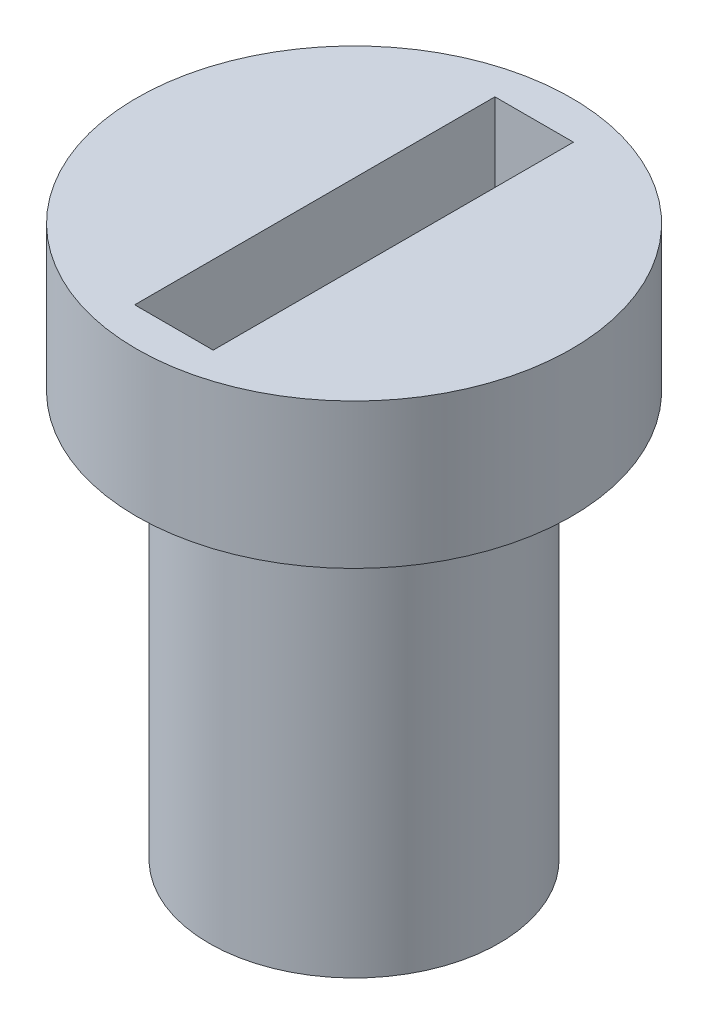
ISO-10303-21;
HEADER;
FILE_DESCRIPTION(('STEP AP214'),'2;1');
FILE_NAME('part.step','',(''),(''),'','','');
FILE_SCHEMA(('AUTOMOTIVE_DESIGN { 1 0 10303 214 1 1 1 1 }'));
ENDSEC;
DATA;
#1=APPLICATION_CONTEXT('core data for automotive mechanical design processes');
#2=APPLICATION_PROTOCOL_DEFINITION('international standard','automotive_design',2000,#1);
#3=PRODUCT_CONTEXT('',#1,'mechanical');
#4=PRODUCT('Part','Part','',(#3));
#5=PRODUCT_RELATED_PRODUCT_CATEGORY('part','',(#4));
#6=PRODUCT_DEFINITION_FORMATION('','',#4);
#7=PRODUCT_DEFINITION_CONTEXT('part definition',#1,'design');
#8=PRODUCT_DEFINITION('design','',#6,#7);
#9=PRODUCT_DEFINITION_SHAPE('','',#8);
#10=(LENGTH_UNIT() NAMED_UNIT(*) SI_UNIT(.MILLI.,.METRE.));
#11=(NAMED_UNIT(*) PLANE_ANGLE_UNIT() SI_UNIT($,.RADIAN.));
#12=(NAMED_UNIT(*) SI_UNIT($,.STERADIAN.) SOLID_ANGLE_UNIT());
#13=UNCERTAINTY_MEASURE_WITH_UNIT(LENGTH_MEASURE(1.E-05),#10,'distance_accuracy_value','');
#14=(GEOMETRIC_REPRESENTATION_CONTEXT(3) GLOBAL_UNCERTAINTY_ASSIGNED_CONTEXT((#13)) GLOBAL_UNIT_ASSIGNED_CONTEXT((#10,
#11,#12)) REPRESENTATION_CONTEXT('',''));
#15=CARTESIAN_POINT('',(0.,0.,0.));
#16=DIRECTION('',(0.,0.,1.));
#17=DIRECTION('',(1.,0.,0.));
#18=AXIS2_PLACEMENT_3D('',#15,#16,#17);
#19=CARTESIAN_POINT('',(0.,5.,0.));
#20=DIRECTION('',(0.,1.,0.));
#21=DIRECTION('',(0.,0.,1.));
#22=AXIS2_PLACEMENT_3D('',#19,#20,#21);
#23=PLANE('',#22);
#24=CARTESIAN_POINT('',(0.,5.,0.));
#25=DIRECTION('',(0.,1.,0.));
#26=DIRECTION('',(0.,0.,1.));
#27=AXIS2_PLACEMENT_3D('',#24,#25,#26);
#28=CIRCLE('',#27,7.5);
#29=CARTESIAN_POINT('',(0.,5.,7.5));
#30=VERTEX_POINT('',#29);
#31=EDGE_CURVE('E116',#30,#30,#28,.T.);
#32=ORIENTED_EDGE('',*,*,#31,.T.);
#33=EDGE_LOOP('',(#32));
#34=FACE_BOUND('',#33,.T.);
#35=DIRECTION('',(-1.,0.,0.));
#36=VECTOR('',#35,1.);
#37=CARTESIAN_POINT('',(0.,5.,6.21227564859583));
#38=LINE('',#37,#36);
#39=CARTESIAN_POINT('',(1.35405289586164,5.,6.21227564859583));
#40=VERTEX_POINT('',#39);
#41=CARTESIAN_POINT('',(-1.35405289586164,5.,6.21227564859583));
#42=VERTEX_POINT('',#41);
#43=EDGE_CURVE('E49',#40,#42,#38,.T.);
#44=ORIENTED_EDGE('',*,*,#43,.T.);
#45=DIRECTION('',(0.,0.,-1.));
#46=VECTOR('',#45,1.);
#47=CARTESIAN_POINT('',(-1.35405289586164,5.,0.));
#48=LINE('',#47,#46);
#49=CARTESIAN_POINT('',(-1.35405289586164,5.,-6.21227564859583));
#50=VERTEX_POINT('',#49);
#51=EDGE_CURVE('E11',#42,#50,#48,.T.);
#52=ORIENTED_EDGE('',*,*,#51,.T.);
#53=DIRECTION('',(1.,0.,0.));
#54=VECTOR('',#53,1.);
#55=CARTESIAN_POINT('',(0.,5.,-6.21227564859583));
#56=LINE('',#55,#54);
#57=CARTESIAN_POINT('',(1.35405289586164,5.,-6.21227564859583));
#58=VERTEX_POINT('',#57);
#59=EDGE_CURVE('E115',#50,#58,#56,.T.);
#60=ORIENTED_EDGE('',*,*,#59,.T.);
#61=DIRECTION('',(0.,0.,1.));
#62=VECTOR('',#61,1.);
#63=CARTESIAN_POINT('',(1.35405289586164,5.,0.));
#64=LINE('',#63,#62);
#65=EDGE_CURVE('E123',#58,#40,#64,.T.);
#66=ORIENTED_EDGE('',*,*,#65,.T.);
#67=EDGE_LOOP('',(#44,#52,#60,#66));
#68=FACE_BOUND('',#67,.T.);
#69=ADVANCED_FACE('F41',(#34,#68),#23,.T.);
#70=CARTESIAN_POINT('',(0.,5.,0.));
#71=DIRECTION('',(0.,-1.,0.));
#72=DIRECTION('',(0.,0.,-1.));
#73=AXIS2_PLACEMENT_3D('',#70,#71,#72);
#74=CYLINDRICAL_SURFACE('',#73,7.5);
#75=ORIENTED_EDGE('',*,*,#31,.F.);
#76=EDGE_LOOP('',(#75));
#77=FACE_BOUND('',#76,.T.);
#78=CARTESIAN_POINT('',(0.,0.,0.));
#79=DIRECTION('',(0.,1.,0.));
#80=DIRECTION('',(0.,0.,1.));
#81=AXIS2_PLACEMENT_3D('',#78,#79,#80);
#82=CIRCLE('',#81,7.5);
#83=CARTESIAN_POINT('',(0.,0.,7.5));
#84=VERTEX_POINT('',#83);
#85=EDGE_CURVE('E111',#84,#84,#82,.T.);
#86=ORIENTED_EDGE('',*,*,#85,.T.);
#87=EDGE_LOOP('',(#86));
#88=FACE_BOUND('',#87,.T.);
#89=ADVANCED_FACE('F43',(#77,#88),#74,.T.);
#90=CARTESIAN_POINT('',(0.,0.,0.));
#91=DIRECTION('',(0.,1.,0.));
#92=DIRECTION('',(0.,0.,1.));
#93=AXIS2_PLACEMENT_3D('',#90,#91,#92);
#94=PLANE('',#93);
#95=CARTESIAN_POINT('',(0.,0.,0.));
#96=DIRECTION('',(0.,-1.,0.));
#97=DIRECTION('',(0.,0.,-1.));
#98=AXIS2_PLACEMENT_3D('',#95,#96,#97);
#99=CIRCLE('',#98,5.);
#100=CARTESIAN_POINT('',(0.,0.,-5.));
#101=VERTEX_POINT('',#100);
#102=EDGE_CURVE('E112',#101,#101,#99,.T.);
#103=ORIENTED_EDGE('',*,*,#102,.F.);
#104=EDGE_LOOP('',(#103));
#105=FACE_BOUND('',#104,.T.);
#106=ORIENTED_EDGE('',*,*,#85,.F.);
#107=EDGE_LOOP('',(#106));
#108=FACE_BOUND('',#107,.T.);
#109=ADVANCED_FACE('F143',(#105,#108),#94,.F.);
#110=CARTESIAN_POINT('',(0.,-14.,0.));
#111=DIRECTION('',(0.,1.,0.));
#112=DIRECTION('',(0.,0.,1.));
#113=AXIS2_PLACEMENT_3D('',#110,#111,#112);
#114=CYLINDRICAL_SURFACE('',#113,5.);
#115=CARTESIAN_POINT('',(0.,-14.,0.));
#116=DIRECTION('',(0.,-1.,0.));
#117=DIRECTION('',(0.,0.,-1.));
#118=AXIS2_PLACEMENT_3D('',#115,#116,#117);
#119=CIRCLE('',#118,5.);
#120=CARTESIAN_POINT('',(0.,-14.,-5.));
#121=VERTEX_POINT('',#120);
#122=EDGE_CURVE('E87',#121,#121,#119,.T.);
#123=ORIENTED_EDGE('',*,*,#122,.F.);
#124=EDGE_LOOP('',(#123));
#125=FACE_BOUND('',#124,.T.);
#126=ORIENTED_EDGE('',*,*,#102,.T.);
#127=EDGE_LOOP('',(#126));
#128=FACE_BOUND('',#127,.T.);
#129=ADVANCED_FACE('F146',(#125,#128),#114,.T.);
#130=CARTESIAN_POINT('',(0.,-14.,0.));
#131=DIRECTION('',(0.,-1.,0.));
#132=DIRECTION('',(0.,0.,-1.));
#133=AXIS2_PLACEMENT_3D('',#130,#131,#132);
#134=PLANE('',#133);
#135=ORIENTED_EDGE('',*,*,#122,.T.);
#136=EDGE_LOOP('',(#135));
#137=FACE_BOUND('',#136,.T.);
#138=ADVANCED_FACE('F153',(#137),#134,.T.);
#139=CARTESIAN_POINT('',(-1.35405289586164,5.000012,-6.21227564859583));
#140=DIRECTION('',(1.,0.,0.));
#141=DIRECTION('',(0.,0.,-1.));
#142=AXIS2_PLACEMENT_3D('',#139,#140,#141);
#143=PLANE('',#142);
#144=DIRECTION('',(0.,-1.,0.));
#145=VECTOR('',#144,1.);
#146=CARTESIAN_POINT('',(-1.35405289586164,5.000012,6.21227564859583));
#147=LINE('',#146,#145);
#148=CARTESIAN_POINT('',(-1.35405289586164,2.,6.21227564859583));
#149=VERTEX_POINT('',#148);
#150=EDGE_CURVE('E79',#42,#149,#147,.T.);
#151=ORIENTED_EDGE('',*,*,#150,.T.);
#152=DIRECTION('',(0.,0.,1.));
#153=VECTOR('',#152,1.);
#154=CARTESIAN_POINT('',(-1.35405289586164,2.,-6.21227564859583));
#155=LINE('',#154,#153);
#156=CARTESIAN_POINT('',(-1.35405289586164,2.,-6.21227564859583));
#157=VERTEX_POINT('',#156);
#158=EDGE_CURVE('E83',#157,#149,#155,.T.);
#159=ORIENTED_EDGE('',*,*,#158,.F.);
#160=DIRECTION('',(0.,-1.,0.));
#161=VECTOR('',#160,1.);
#162=CARTESIAN_POINT('',(-1.35405289586164,5.000012,-6.21227564859583));
#163=LINE('',#162,#161);
#164=EDGE_CURVE('E105',#50,#157,#163,.T.);
#165=ORIENTED_EDGE('',*,*,#164,.F.);
#166=ORIENTED_EDGE('',*,*,#51,.F.);
#167=EDGE_LOOP('',(#151,#159,#165,#166));
#168=FACE_BOUND('',#167,.T.);
#169=ADVANCED_FACE('F81',(#168),#143,.T.);
#170=CARTESIAN_POINT('',(-1.35405289586164,5.000012,6.21227564859583));
#171=DIRECTION('',(0.,0.,-1.));
#172=DIRECTION('',(-1.,0.,0.));
#173=AXIS2_PLACEMENT_3D('',#170,#171,#172);
#174=PLANE('',#173);
#175=DIRECTION('',(0.,-1.,0.));
#176=VECTOR('',#175,1.);
#177=CARTESIAN_POINT('',(1.35405289586164,5.000012,6.21227564859583));
#178=LINE('',#177,#176);
#179=CARTESIAN_POINT('',(1.35405289586164,2.,6.21227564859583));
#180=VERTEX_POINT('',#179);
#181=EDGE_CURVE('E88',#40,#180,#178,.T.);
#182=ORIENTED_EDGE('',*,*,#181,.T.);
#183=DIRECTION('',(1.,0.,0.));
#184=VECTOR('',#183,1.);
#185=CARTESIAN_POINT('',(-1.35405289586164,2.,6.21227564859583));
#186=LINE('',#185,#184);
#187=EDGE_CURVE('E91',#149,#180,#186,.T.);
#188=ORIENTED_EDGE('',*,*,#187,.F.);
#189=ORIENTED_EDGE('',*,*,#150,.F.);
#190=ORIENTED_EDGE('',*,*,#43,.F.);
#191=EDGE_LOOP('',(#182,#188,#189,#190));
#192=FACE_BOUND('',#191,.T.);
#193=ADVANCED_FACE('F92',(#192),#174,.T.);
#194=CARTESIAN_POINT('',(1.35405289586164,5.000012,-6.21227564859583));
#195=DIRECTION('',(-1.,0.,0.));
#196=DIRECTION('',(0.,0.,1.));
#197=AXIS2_PLACEMENT_3D('',#194,#195,#196);
#198=PLANE('',#197);
#199=DIRECTION('',(0.,-1.,0.));
#200=VECTOR('',#199,1.);
#201=CARTESIAN_POINT('',(1.35405289586164,5.000012,-6.21227564859583));
#202=LINE('',#201,#200);
#203=CARTESIAN_POINT('',(1.35405289586164,2.,-6.21227564859583));
#204=VERTEX_POINT('',#203);
#205=EDGE_CURVE('E56',#58,#204,#202,.T.);
#206=ORIENTED_EDGE('',*,*,#205,.T.);
#207=DIRECTION('',(0.,0.,-1.));
#208=VECTOR('',#207,1.);
#209=CARTESIAN_POINT('',(1.35405289586164,2.,-6.21227564859583));
#210=LINE('',#209,#208);
#211=EDGE_CURVE('E97',#180,#204,#210,.T.);
#212=ORIENTED_EDGE('',*,*,#211,.F.);
#213=ORIENTED_EDGE('',*,*,#181,.F.);
#214=ORIENTED_EDGE('',*,*,#65,.F.);
#215=EDGE_LOOP('',(#206,#212,#213,#214));
#216=FACE_BOUND('',#215,.T.);
#217=ADVANCED_FACE('F127',(#216),#198,.T.);
#218=CARTESIAN_POINT('',(-1.35405289586164,5.000012,-6.21227564859583));
#219=DIRECTION('',(0.,0.,1.));
#220=DIRECTION('',(1.,0.,0.));
#221=AXIS2_PLACEMENT_3D('',#218,#219,#220);
#222=PLANE('',#221);
#223=ORIENTED_EDGE('',*,*,#164,.T.);
#224=DIRECTION('',(-1.,0.,0.));
#225=VECTOR('',#224,1.);
#226=CARTESIAN_POINT('',(-1.35405289586164,2.,-6.21227564859583));
#227=LINE('',#226,#225);
#228=EDGE_CURVE('E100',#204,#157,#227,.T.);
#229=ORIENTED_EDGE('',*,*,#228,.F.);
#230=ORIENTED_EDGE('',*,*,#205,.F.);
#231=ORIENTED_EDGE('',*,*,#59,.F.);
#232=EDGE_LOOP('',(#223,#229,#230,#231));
#233=FACE_BOUND('',#232,.T.);
#234=ADVANCED_FACE('F128',(#233),#222,.T.);
#235=CARTESIAN_POINT('',(0.,2.,0.));
#236=DIRECTION('',(0.,1.,0.));
#237=DIRECTION('',(0.,0.,1.));
#238=AXIS2_PLACEMENT_3D('',#235,#236,#237);
#239=PLANE('',#238);
#240=ORIENTED_EDGE('',*,*,#158,.T.);
#241=ORIENTED_EDGE('',*,*,#187,.T.);
#242=ORIENTED_EDGE('',*,*,#211,.T.);
#243=ORIENTED_EDGE('',*,*,#228,.T.);
#244=EDGE_LOOP('',(#240,#241,#242,#243));
#245=FACE_BOUND('',#244,.T.);
#246=ADVANCED_FACE('F99',(#245),#239,.T.);
#247=CLOSED_SHELL('',(#69,#89,#109,#129,#138,#169,#193,#217,#234,#246));
#248=MANIFOLD_SOLID_BREP('B2',#247);
#249=ADVANCED_BREP_SHAPE_REPRESENTATION('',(#18,#248),#14);
#250=SHAPE_DEFINITION_REPRESENTATION(#9,#249);
ENDSEC;
END-ISO-10303-21;
